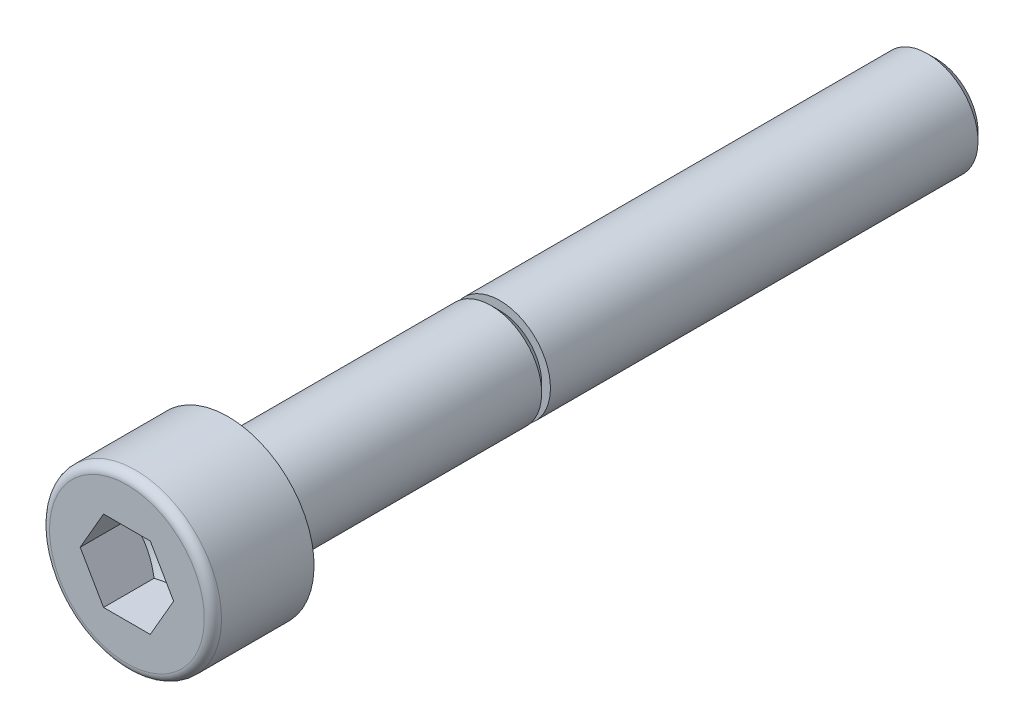
ISO-10303-21;
HEADER;
FILE_DESCRIPTION(('STEP AP214'),'2;1');
FILE_NAME('part.step','',(''),(''),'','','');
FILE_SCHEMA(('AUTOMOTIVE_DESIGN { 1 0 10303 214 1 1 1 1 }'));
ENDSEC;
DATA;
#1=APPLICATION_CONTEXT('core data for automotive mechanical design processes');
#2=APPLICATION_PROTOCOL_DEFINITION('international standard','automotive_design',2000,#1);
#3=PRODUCT_CONTEXT('',#1,'mechanical');
#4=PRODUCT('Part','Part','',(#3));
#5=PRODUCT_RELATED_PRODUCT_CATEGORY('part','',(#4));
#6=PRODUCT_DEFINITION_FORMATION('','',#4);
#7=PRODUCT_DEFINITION_CONTEXT('part definition',#1,'design');
#8=PRODUCT_DEFINITION('design','',#6,#7);
#9=PRODUCT_DEFINITION_SHAPE('','',#8);
#10=(LENGTH_UNIT() NAMED_UNIT(*) SI_UNIT(.MILLI.,.METRE.));
#11=(NAMED_UNIT(*) PLANE_ANGLE_UNIT() SI_UNIT($,.RADIAN.));
#12=(NAMED_UNIT(*) SI_UNIT($,.STERADIAN.) SOLID_ANGLE_UNIT());
#13=UNCERTAINTY_MEASURE_WITH_UNIT(LENGTH_MEASURE(1.E-05),#10,'distance_accuracy_value','');
#14=(GEOMETRIC_REPRESENTATION_CONTEXT(3) GLOBAL_UNCERTAINTY_ASSIGNED_CONTEXT((#13)) GLOBAL_UNIT_ASSIGNED_CONTEXT((#10,
#11,#12)) REPRESENTATION_CONTEXT('',''));
#15=CARTESIAN_POINT('',(0.,0.,0.));
#16=DIRECTION('',(0.,0.,1.));
#17=DIRECTION('',(1.,0.,0.));
#18=AXIS2_PLACEMENT_3D('',#15,#16,#17);
#19=CARTESIAN_POINT('',(0.,0.,1.83333364416674));
#20=DIRECTION('',(0.,0.,1.));
#21=DIRECTION('',(0.,1.,0.));
#22=AXIS2_PLACEMENT_3D('',#19,#20,#21);
#23=CONICAL_SURFACE('',#22,1.1547,1.0471975511966);
#24=CARTESIAN_POINT('',(1.1547,1.99999906749979,2.5));
#25=CARTESIAN_POINT('',(1.73205,0.999999533749893,2.16666682208337));
#26=CARTESIAN_POINT('',(2.3094,0.,2.5));
#27=(BOUNDED_CURVE() B_SPLINE_CURVE(2,(#24,#25,#26),.UNSPECIFIED.,.F.,
.F.) B_SPLINE_CURVE_WITH_KNOTS((3,3),(0.,2.33687118658889),
.UNSPECIFIED.) CURVE() GEOMETRIC_REPRESENTATION_ITEM() RATIONAL_B_SPLINE_CURVE((1.,
1.15470053837925,1.)) REPRESENTATION_ITEM(''));
#28=CARTESIAN_POINT('',(1.1547,1.99999906749979,2.5));
#29=VERTEX_POINT('',#28);
#30=CARTESIAN_POINT('',(2.3094,0.,2.5));
#31=VERTEX_POINT('',#30);
#32=EDGE_CURVE('E147',#29,#31,#27,.T.);
#33=ORIENTED_EDGE('',*,*,#32,.F.);
#34=CARTESIAN_POINT('',(-1.1547,1.99999906749978,2.5));
#35=CARTESIAN_POINT('',(0.,1.99999906749979,2.16666682208337));
#36=CARTESIAN_POINT('',(1.1547,1.99999906749978,2.5));
#37=(BOUNDED_CURVE() B_SPLINE_CURVE(2,(#34,#35,#36),.UNSPECIFIED.,.F.,
.F.) B_SPLINE_CURVE_WITH_KNOTS((3,3),(0.,2.33687118658889),
.UNSPECIFIED.) CURVE() GEOMETRIC_REPRESENTATION_ITEM() RATIONAL_B_SPLINE_CURVE((1.,
1.15470053837925,1.)) REPRESENTATION_ITEM(''));
#38=CARTESIAN_POINT('',(-1.1547,1.99999906749978,2.5));
#39=VERTEX_POINT('',#38);
#40=EDGE_CURVE('E41',#39,#29,#37,.T.);
#41=ORIENTED_EDGE('',*,*,#40,.F.);
#42=CARTESIAN_POINT('',(-2.3094,0.,2.5));
#43=CARTESIAN_POINT('',(-1.73205,0.999999533749893,2.16666682208337));
#44=CARTESIAN_POINT('',(-1.1547,1.99999906749978,2.5));
#45=(BOUNDED_CURVE() B_SPLINE_CURVE(2,(#42,#43,#44),.UNSPECIFIED.,.F.,
.F.) B_SPLINE_CURVE_WITH_KNOTS((3,3),(0.,2.33687118658889),
.UNSPECIFIED.) CURVE() GEOMETRIC_REPRESENTATION_ITEM() RATIONAL_B_SPLINE_CURVE((1.,
1.15470053837925,1.)) REPRESENTATION_ITEM(''));
#46=CARTESIAN_POINT('',(-2.3094,0.,2.5));
#47=VERTEX_POINT('',#46);
#48=EDGE_CURVE('E177',#47,#39,#45,.T.);
#49=ORIENTED_EDGE('',*,*,#48,.F.);
#50=CARTESIAN_POINT('',(-1.1547,-1.99999906749978,2.5));
#51=CARTESIAN_POINT('',(-1.73205,-0.999999533749892,2.16666682208337));
#52=CARTESIAN_POINT('',(-2.3094,0.,2.5));
#53=(BOUNDED_CURVE() B_SPLINE_CURVE(2,(#50,#51,#52),.UNSPECIFIED.,.F.,
.F.) B_SPLINE_CURVE_WITH_KNOTS((3,3),(0.,2.33687118658889),
.UNSPECIFIED.) CURVE() GEOMETRIC_REPRESENTATION_ITEM() RATIONAL_B_SPLINE_CURVE((1.,
1.15470053837925,1.)) REPRESENTATION_ITEM(''));
#54=CARTESIAN_POINT('',(-1.1547,-1.99999906749979,2.5));
#55=VERTEX_POINT('',#54);
#56=EDGE_CURVE('E12',#55,#47,#53,.T.);
#57=ORIENTED_EDGE('',*,*,#56,.F.);
#58=CARTESIAN_POINT('',(1.1547,-1.99999906749978,2.5));
#59=CARTESIAN_POINT('',(0.,-1.99999906749979,2.16666682208337));
#60=CARTESIAN_POINT('',(-1.1547,-1.99999906749978,2.5));
#61=(BOUNDED_CURVE() B_SPLINE_CURVE(2,(#58,#59,#60),.UNSPECIFIED.,.F.,
.F.) B_SPLINE_CURVE_WITH_KNOTS((3,3),(0.,2.33687118658889),
.UNSPECIFIED.) CURVE() GEOMETRIC_REPRESENTATION_ITEM() RATIONAL_B_SPLINE_CURVE((1.,
1.15470053837925,1.)) REPRESENTATION_ITEM(''));
#62=CARTESIAN_POINT('',(1.1547,-1.99999906749978,2.5));
#63=VERTEX_POINT('',#62);
#64=EDGE_CURVE('E130',#63,#55,#61,.T.);
#65=ORIENTED_EDGE('',*,*,#64,.F.);
#66=CARTESIAN_POINT('',(2.3094,0.,2.5));
#67=CARTESIAN_POINT('',(1.73205,-0.999999533749891,2.16666682208337));
#68=CARTESIAN_POINT('',(1.1547,-1.99999906749978,2.5));
#69=(BOUNDED_CURVE() B_SPLINE_CURVE(2,(#66,#67,#68),.UNSPECIFIED.,.F.,
.F.) B_SPLINE_CURVE_WITH_KNOTS((3,3),(0.,2.33687118658888),
.UNSPECIFIED.) CURVE() GEOMETRIC_REPRESENTATION_ITEM() RATIONAL_B_SPLINE_CURVE((1.,
1.15470053837925,1.)) REPRESENTATION_ITEM(''));
#70=EDGE_CURVE('E128',#31,#63,#69,.T.);
#71=ORIENTED_EDGE('',*,*,#70,.F.);
#72=EDGE_LOOP('',(#33,#41,#49,#57,#65,#71));
#73=FACE_BOUND('',#72,.T.);
#74=CARTESIAN_POINT('',(0.,0.,1.16666728833348));
#75=VERTEX_POINT('',#74);
#76=VERTEX_LOOP('',#75);
#77=FACE_BOUND('',#76,.T.);
#78=ADVANCED_FACE('F23',(#73,#77),#23,.F.);
#79=CARTESIAN_POINT('',(-1.73205,-0.999999533749891,5.));
#80=DIRECTION('',(-0.866025403784439,-0.5,0.));
#81=DIRECTION('',(-0.5,0.866025403784439,0.));
#82=AXIS2_PLACEMENT_3D('',#79,#80,#81);
#83=PLANE('',#82);
#84=ORIENTED_EDGE('',*,*,#56,.T.);
#85=DIRECTION('',(0.,0.,-1.));
#86=VECTOR('',#85,1.);
#87=CARTESIAN_POINT('',(-2.3094,0.,5.));
#88=LINE('',#87,#86);
#89=CARTESIAN_POINT('',(-2.3094,0.,5.));
#90=VERTEX_POINT('',#89);
#91=EDGE_CURVE('E172',#90,#47,#88,.T.);
#92=ORIENTED_EDGE('',*,*,#91,.F.);
#93=DIRECTION('',(-0.5,0.866025403784439,0.));
#94=VECTOR('',#93,1.);
#95=CARTESIAN_POINT('',(-2.14611839618444,-0.282812033749892,5.));
#96=LINE('',#95,#94);
#97=CARTESIAN_POINT('',(-1.1547,-1.99999906749978,5.));
#98=VERTEX_POINT('',#97);
#99=EDGE_CURVE('E160',#98,#90,#96,.T.);
#100=ORIENTED_EDGE('',*,*,#99,.F.);
#101=DIRECTION('',(0.,0.,-1.));
#102=VECTOR('',#101,1.);
#103=CARTESIAN_POINT('',(-1.1547,-1.99999906749978,5.));
#104=LINE('',#103,#102);
#105=EDGE_CURVE('E32',#98,#55,#104,.T.);
#106=ORIENTED_EDGE('',*,*,#105,.T.);
#107=EDGE_LOOP('',(#84,#92,#100,#106));
#108=FACE_BOUND('',#107,.T.);
#109=ADVANCED_FACE('F215',(#108),#83,.F.);
#110=CARTESIAN_POINT('',(0.,-1.99999906749978,5.));
#111=DIRECTION('',(0.,-1.,0.));
#112=DIRECTION('',(-1.,0.,0.));
#113=AXIS2_PLACEMENT_3D('',#110,#111,#112);
#114=PLANE('',#113);
#115=ORIENTED_EDGE('',*,*,#64,.T.);
#116=ORIENTED_EDGE('',*,*,#105,.F.);
#117=DIRECTION('',(-1.,0.,0.));
#118=VECTOR('',#117,1.);
#119=CARTESIAN_POINT('',(0.,-1.99999906749978,5.));
#120=LINE('',#119,#118);
#121=CARTESIAN_POINT('',(1.1547,-1.99999906749978,5.));
#122=VERTEX_POINT('',#121);
#123=EDGE_CURVE('E112',#122,#98,#120,.T.);
#124=ORIENTED_EDGE('',*,*,#123,.F.);
#125=DIRECTION('',(0.,0.,-1.));
#126=VECTOR('',#125,1.);
#127=CARTESIAN_POINT('',(1.1547,-1.99999906749978,5.));
#128=LINE('',#127,#126);
#129=EDGE_CURVE('E116',#122,#63,#128,.T.);
#130=ORIENTED_EDGE('',*,*,#129,.T.);
#131=EDGE_LOOP('',(#115,#116,#124,#130));
#132=FACE_BOUND('',#131,.T.);
#133=ADVANCED_FACE('F115',(#132),#114,.F.);
#134=CARTESIAN_POINT('',(1.73205,-0.999999533749891,5.));
#135=DIRECTION('',(0.866025403784439,-0.5,0.));
#136=DIRECTION('',(-0.5,-0.866025403784439,0.));
#137=AXIS2_PLACEMENT_3D('',#134,#135,#136);
#138=PLANE('',#137);
#139=ORIENTED_EDGE('',*,*,#70,.T.);
#140=ORIENTED_EDGE('',*,*,#129,.F.);
#141=DIRECTION('',(-0.5,-0.866025403784439,0.));
#142=VECTOR('',#141,1.);
#143=CARTESIAN_POINT('',(2.14611839618444,-0.282812033749892,5.));
#144=LINE('',#143,#142);
#145=CARTESIAN_POINT('',(2.3094,0.,5.));
#146=VERTEX_POINT('',#145);
#147=EDGE_CURVE('E120',#146,#122,#144,.T.);
#148=ORIENTED_EDGE('',*,*,#147,.F.);
#149=DIRECTION('',(0.,0.,-1.));
#150=VECTOR('',#149,1.);
#151=CARTESIAN_POINT('',(2.3094,0.,5.));
#152=LINE('',#151,#150);
#153=EDGE_CURVE('E145',#146,#31,#152,.T.);
#154=ORIENTED_EDGE('',*,*,#153,.T.);
#155=EDGE_LOOP('',(#139,#140,#148,#154));
#156=FACE_BOUND('',#155,.T.);
#157=ADVANCED_FACE('F124',(#156),#138,.F.);
#158=CARTESIAN_POINT('',(1.73205,0.999999533749891,5.));
#159=DIRECTION('',(0.866025403784439,0.5,0.));
#160=DIRECTION('',(0.5,-0.866025403784439,0.));
#161=AXIS2_PLACEMENT_3D('',#158,#159,#160);
#162=PLANE('',#161);
#163=ORIENTED_EDGE('',*,*,#32,.T.);
#164=ORIENTED_EDGE('',*,*,#153,.F.);
#165=DIRECTION('',(0.5,-0.866025403784439,0.));
#166=VECTOR('',#165,1.);
#167=CARTESIAN_POINT('',(1.31798160381557,1.71718703374989,5.));
#168=LINE('',#167,#166);
#169=CARTESIAN_POINT('',(1.1547,1.99999906749978,5.));
#170=VERTEX_POINT('',#169);
#171=EDGE_CURVE('E137',#170,#146,#168,.T.);
#172=ORIENTED_EDGE('',*,*,#171,.F.);
#173=DIRECTION('',(0.,0.,-1.));
#174=VECTOR('',#173,1.);
#175=CARTESIAN_POINT('',(1.1547,1.99999906749978,5.));
#176=LINE('',#175,#174);
#177=EDGE_CURVE('E181',#170,#29,#176,.T.);
#178=ORIENTED_EDGE('',*,*,#177,.T.);
#179=EDGE_LOOP('',(#163,#164,#172,#178));
#180=FACE_BOUND('',#179,.T.);
#181=ADVANCED_FACE('F224',(#180),#162,.F.);
#182=CARTESIAN_POINT('',(0.,1.99999906749978,5.));
#183=DIRECTION('',(0.,1.,0.));
#184=DIRECTION('',(1.,0.,0.));
#185=AXIS2_PLACEMENT_3D('',#182,#183,#184);
#186=PLANE('',#185);
#187=ORIENTED_EDGE('',*,*,#40,.T.);
#188=ORIENTED_EDGE('',*,*,#177,.F.);
#189=DIRECTION('',(1.,0.,0.));
#190=VECTOR('',#189,1.);
#191=CARTESIAN_POINT('',(0.,1.99999906749978,5.));
#192=LINE('',#191,#190);
#193=CARTESIAN_POINT('',(-1.1547,1.99999906749978,5.));
#194=VERTEX_POINT('',#193);
#195=EDGE_CURVE('E139',#194,#170,#192,.T.);
#196=ORIENTED_EDGE('',*,*,#195,.F.);
#197=DIRECTION('',(0.,0.,-1.));
#198=VECTOR('',#197,1.);
#199=CARTESIAN_POINT('',(-1.1547,1.99999906749978,5.));
#200=LINE('',#199,#198);
#201=EDGE_CURVE('E227',#194,#39,#200,.T.);
#202=ORIENTED_EDGE('',*,*,#201,.T.);
#203=EDGE_LOOP('',(#187,#188,#196,#202));
#204=FACE_BOUND('',#203,.T.);
#205=ADVANCED_FACE('F225',(#204),#186,.F.);
#206=CARTESIAN_POINT('',(-1.73205,0.999999533749891,5.));
#207=DIRECTION('',(-0.866025403784439,0.5,0.));
#208=DIRECTION('',(0.5,0.866025403784439,0.));
#209=AXIS2_PLACEMENT_3D('',#206,#207,#208);
#210=PLANE('',#209);
#211=ORIENTED_EDGE('',*,*,#48,.T.);
#212=ORIENTED_EDGE('',*,*,#201,.F.);
#213=DIRECTION('',(0.5,0.866025403784439,0.));
#214=VECTOR('',#213,1.);
#215=CARTESIAN_POINT('',(-1.31798160381557,1.71718703374989,5.));
#216=LINE('',#215,#214);
#217=EDGE_CURVE('E158',#90,#194,#216,.T.);
#218=ORIENTED_EDGE('',*,*,#217,.F.);
#219=ORIENTED_EDGE('',*,*,#91,.T.);
#220=EDGE_LOOP('',(#211,#212,#218,#219));
#221=FACE_BOUND('',#220,.T.);
#222=ADVANCED_FACE('F229',(#221),#210,.F.);
#223=CARTESIAN_POINT('',(0.,0.,4.575));
#224=DIRECTION('',(0.,0.,-1.));
#225=DIRECTION('',(-1.,0.,0.));
#226=AXIS2_PLACEMENT_3D('',#223,#224,#225);
#227=TOROIDAL_SURFACE('',#226,3.825,0.425);
#228=CARTESIAN_POINT('',(0.,0.,4.575));
#229=DIRECTION('',(0.,0.,-1.));
#230=DIRECTION('',(0.,1.,0.));
#231=AXIS2_PLACEMENT_3D('',#228,#229,#230);
#232=CIRCLE('',#231,4.25);
#233=CARTESIAN_POINT('',(0.,4.25,4.575));
#234=VERTEX_POINT('',#233);
#235=EDGE_CURVE('E168',#234,#234,#232,.T.);
#236=ORIENTED_EDGE('',*,*,#235,.F.);
#237=EDGE_LOOP('',(#236));
#238=FACE_BOUND('',#237,.T.);
#239=CARTESIAN_POINT('',(0.,0.,5.));
#240=DIRECTION('',(0.,0.,-1.));
#241=DIRECTION('',(0.,1.,0.));
#242=AXIS2_PLACEMENT_3D('',#239,#240,#241);
#243=CIRCLE('',#242,3.825);
#244=CARTESIAN_POINT('',(0.,3.825,5.));
#245=VERTEX_POINT('',#244);
#246=EDGE_CURVE('E143',#245,#245,#243,.T.);
#247=ORIENTED_EDGE('',*,*,#246,.T.);
#248=EDGE_LOOP('',(#247));
#249=FACE_BOUND('',#248,.T.);
#250=ADVANCED_FACE('F255',(#238,#249),#227,.T.);
#251=CARTESIAN_POINT('',(0.,0.,2.2875));
#252=DIRECTION('',(0.,0.,1.));
#253=DIRECTION('',(0.,1.,0.));
#254=AXIS2_PLACEMENT_3D('',#251,#252,#253);
#255=CYLINDRICAL_SURFACE('',#254,4.25);
#256=CARTESIAN_POINT('',(0.,0.,0.));
#257=DIRECTION('',(0.,0.,-1.));
#258=DIRECTION('',(0.,1.,0.));
#259=AXIS2_PLACEMENT_3D('',#256,#257,#258);
#260=CIRCLE('',#259,4.25);
#261=CARTESIAN_POINT('',(0.,4.25,0.));
#262=VERTEX_POINT('',#261);
#263=EDGE_CURVE('E151',#262,#262,#260,.T.);
#264=ORIENTED_EDGE('',*,*,#263,.F.);
#265=EDGE_LOOP('',(#264));
#266=FACE_BOUND('',#265,.T.);
#267=ORIENTED_EDGE('',*,*,#235,.T.);
#268=EDGE_LOOP('',(#267));
#269=FACE_BOUND('',#268,.T.);
#270=ADVANCED_FACE('F272',(#266,#269),#255,.T.);
#271=CARTESIAN_POINT('',(0.,3.5,0.));
#272=DIRECTION('',(0.,0.,-1.));
#273=DIRECTION('',(0.,1.,0.));
#274=AXIS2_PLACEMENT_3D('',#271,#272,#273);
#275=PLANE('',#274);
#276=CARTESIAN_POINT('',(0.,0.,0.));
#277=DIRECTION('',(0.,0.,-1.));
#278=DIRECTION('',(0.,1.,0.));
#279=AXIS2_PLACEMENT_3D('',#276,#277,#278);
#280=CIRCLE('',#279,2.75);
#281=CARTESIAN_POINT('',(0.,2.75,0.));
#282=VERTEX_POINT('',#281);
#283=EDGE_CURVE('E148',#282,#282,#280,.T.);
#284=ORIENTED_EDGE('',*,*,#283,.F.);
#285=EDGE_LOOP('',(#284));
#286=FACE_BOUND('',#285,.T.);
#287=ORIENTED_EDGE('',*,*,#263,.T.);
#288=EDGE_LOOP('',(#287));
#289=FACE_BOUND('',#288,.T.);
#290=ADVANCED_FACE('F209',(#286,#289),#275,.T.);
#291=CARTESIAN_POINT('',(0.,0.,-0.25));
#292=DIRECTION('',(0.,0.,-1.));
#293=DIRECTION('',(-1.,0.,0.));
#294=AXIS2_PLACEMENT_3D('',#291,#292,#293);
#295=TOROIDAL_SURFACE('',#294,2.75,0.25);
#296=CARTESIAN_POINT('',(0.,0.,-0.25));
#297=DIRECTION('',(0.,0.,-1.));
#298=DIRECTION('',(0.,1.,0.));
#299=AXIS2_PLACEMENT_3D('',#296,#297,#298);
#300=CIRCLE('',#299,2.5);
#301=CARTESIAN_POINT('',(0.,2.5,-0.25));
#302=VERTEX_POINT('',#301);
#303=EDGE_CURVE('E152',#302,#302,#300,.T.);
#304=ORIENTED_EDGE('',*,*,#303,.F.);
#305=EDGE_LOOP('',(#304));
#306=FACE_BOUND('',#305,.T.);
#307=ORIENTED_EDGE('',*,*,#283,.T.);
#308=EDGE_LOOP('',(#307));
#309=FACE_BOUND('',#308,.T.);
#310=ADVANCED_FACE('F200',(#306,#309),#295,.F.);
#311=CARTESIAN_POINT('',(0.,0.,-6.625));
#312=DIRECTION('',(0.,0.,1.));
#313=DIRECTION('',(0.,1.,0.));
#314=AXIS2_PLACEMENT_3D('',#311,#312,#313);
#315=CYLINDRICAL_SURFACE('',#314,2.5);
#316=CARTESIAN_POINT('',(0.,0.,-13.));
#317=DIRECTION('',(0.,0.,-1.));
#318=DIRECTION('',(0.,1.,0.));
#319=AXIS2_PLACEMENT_3D('',#316,#317,#318);
#320=CIRCLE('',#319,2.5);
#321=CARTESIAN_POINT('',(0.,2.5,-13.));
#322=VERTEX_POINT('',#321);
#323=EDGE_CURVE('E26',#322,#322,#320,.T.);
#324=ORIENTED_EDGE('',*,*,#323,.F.);
#325=EDGE_LOOP('',(#324));
#326=FACE_BOUND('',#325,.T.);
#327=ORIENTED_EDGE('',*,*,#303,.T.);
#328=EDGE_LOOP('',(#327));
#329=FACE_BOUND('',#328,.T.);
#330=ADVANCED_FACE('F198',(#326,#329),#315,.T.);
#331=CARTESIAN_POINT('',(0.,0.,-13.2165));
#332=DIRECTION('',(0.,0.,1.));
#333=DIRECTION('',(0.,1.,0.));
#334=AXIS2_PLACEMENT_3D('',#331,#332,#333);
#335=CONICAL_SURFACE('',#334,2.2835,0.785398163397449);
#336=CARTESIAN_POINT('',(0.,0.,-13.433));
#337=DIRECTION('',(0.,0.,-1.));
#338=DIRECTION('',(0.,1.,0.));
#339=AXIS2_PLACEMENT_3D('',#336,#337,#338);
#340=CIRCLE('',#339,2.067);
#341=CARTESIAN_POINT('',(0.,2.067,-13.433));
#342=VERTEX_POINT('',#341);
#343=EDGE_CURVE('E183',#342,#342,#340,.T.);
#344=ORIENTED_EDGE('',*,*,#343,.F.);
#345=EDGE_LOOP('',(#344));
#346=FACE_BOUND('',#345,.T.);
#347=ORIENTED_EDGE('',*,*,#323,.T.);
#348=EDGE_LOOP('',(#347));
#349=FACE_BOUND('',#348,.T.);
#350=ADVANCED_FACE('F196',(#346,#349),#335,.T.);
#351=CARTESIAN_POINT('',(0.,2.2835,-13.433));
#352=DIRECTION('',(0.,0.,1.));
#353=DIRECTION('',(0.,-1.,0.));
#354=AXIS2_PLACEMENT_3D('',#351,#352,#353);
#355=PLANE('',#354);
#356=CARTESIAN_POINT('',(0.,0.,-13.433));
#357=DIRECTION('',(0.,0.,-1.));
#358=DIRECTION('',(0.,1.,0.));
#359=AXIS2_PLACEMENT_3D('',#356,#357,#358);
#360=CIRCLE('',#359,2.5);
#361=CARTESIAN_POINT('',(0.,2.5,-13.433));
#362=VERTEX_POINT('',#361);
#363=EDGE_CURVE('E90',#362,#362,#360,.T.);
#364=ORIENTED_EDGE('',*,*,#363,.F.);
#365=EDGE_LOOP('',(#364));
#366=FACE_BOUND('',#365,.T.);
#367=ORIENTED_EDGE('',*,*,#343,.T.);
#368=EDGE_LOOP('',(#367));
#369=FACE_BOUND('',#368,.T.);
#370=ADVANCED_FACE('F207',(#366,#369),#355,.T.);
#371=CARTESIAN_POINT('',(0.,0.,-24.));
#372=DIRECTION('',(0.,0.,1.));
#373=DIRECTION('',(0.,1.,0.));
#374=AXIS2_PLACEMENT_3D('',#371,#372,#373);
#375=CYLINDRICAL_SURFACE('',#374,2.5);
#376=CARTESIAN_POINT('',(0.,0.,-34.567));
#377=DIRECTION('',(0.,0.,-1.));
#378=DIRECTION('',(0.,1.,0.));
#379=AXIS2_PLACEMENT_3D('',#376,#377,#378);
#380=CIRCLE('',#379,2.5);
#381=CARTESIAN_POINT('',(0.,2.5,-34.567));
#382=VERTEX_POINT('',#381);
#383=EDGE_CURVE('E96',#382,#382,#380,.T.);
#384=ORIENTED_EDGE('',*,*,#383,.F.);
#385=EDGE_LOOP('',(#384));
#386=FACE_BOUND('',#385,.T.);
#387=ORIENTED_EDGE('',*,*,#363,.T.);
#388=EDGE_LOOP('',(#387));
#389=FACE_BOUND('',#388,.T.);
#390=ADVANCED_FACE('F274',(#386,#389),#375,.T.);
#391=CARTESIAN_POINT('',(0.,0.,-34.7835));
#392=DIRECTION('',(0.,0.,1.));
#393=DIRECTION('',(0.,1.,0.));
#394=AXIS2_PLACEMENT_3D('',#391,#392,#393);
#395=CONICAL_SURFACE('',#394,2.2835,0.785398163397448);
#396=CARTESIAN_POINT('',(0.,0.,-35.));
#397=DIRECTION('',(0.,0.,-1.));
#398=DIRECTION('',(0.,1.,0.));
#399=AXIS2_PLACEMENT_3D('',#396,#397,#398);
#400=CIRCLE('',#399,2.067);
#401=CARTESIAN_POINT('',(0.,2.067,-35.));
#402=VERTEX_POINT('',#401);
#403=EDGE_CURVE('E163',#402,#402,#400,.T.);
#404=ORIENTED_EDGE('',*,*,#403,.F.);
#405=EDGE_LOOP('',(#404));
#406=FACE_BOUND('',#405,.T.);
#407=ORIENTED_EDGE('',*,*,#383,.T.);
#408=EDGE_LOOP('',(#407));
#409=FACE_BOUND('',#408,.T.);
#410=ADVANCED_FACE('F262',(#406,#409),#395,.T.);
#411=CARTESIAN_POINT('',(0.,1.0335,-35.));
#412=DIRECTION('',(0.,0.,-1.));
#413=DIRECTION('',(0.,1.,0.));
#414=AXIS2_PLACEMENT_3D('',#411,#412,#413);
#415=PLANE('',#414);
#416=ORIENTED_EDGE('',*,*,#403,.T.);
#417=EDGE_LOOP('',(#416));
#418=FACE_BOUND('',#417,.T.);
#419=ADVANCED_FACE('F257',(#418),#415,.T.);
#420=CARTESIAN_POINT('',(0.,1.9125,5.));
#421=DIRECTION('',(0.,0.,1.));
#422=DIRECTION('',(0.,-1.,0.));
#423=AXIS2_PLACEMENT_3D('',#420,#421,#422);
#424=PLANE('',#423);
#425=ORIENTED_EDGE('',*,*,#99,.T.);
#426=ORIENTED_EDGE('',*,*,#217,.T.);
#427=ORIENTED_EDGE('',*,*,#195,.T.);
#428=ORIENTED_EDGE('',*,*,#171,.T.);
#429=ORIENTED_EDGE('',*,*,#147,.T.);
#430=ORIENTED_EDGE('',*,*,#123,.T.);
#431=EDGE_LOOP('',(#425,#426,#427,#428,#429,#430));
#432=FACE_BOUND('',#431,.T.);
#433=ORIENTED_EDGE('',*,*,#246,.F.);
#434=EDGE_LOOP('',(#433));
#435=FACE_BOUND('',#434,.T.);
#436=ADVANCED_FACE('F133',(#432,#435),#424,.T.);
#437=CLOSED_SHELL('',(#78,#109,#133,#157,#181,#205,#222,#250,#270,#290,#310,#330,#350,#370,#390,
#410,#419,#436));
#438=MANIFOLD_SOLID_BREP('B1',#437);
#439=ADVANCED_BREP_SHAPE_REPRESENTATION('',(#18,#438),#14);
#440=SHAPE_DEFINITION_REPRESENTATION(#9,#439);
ENDSEC;
END-ISO-10303-21;
